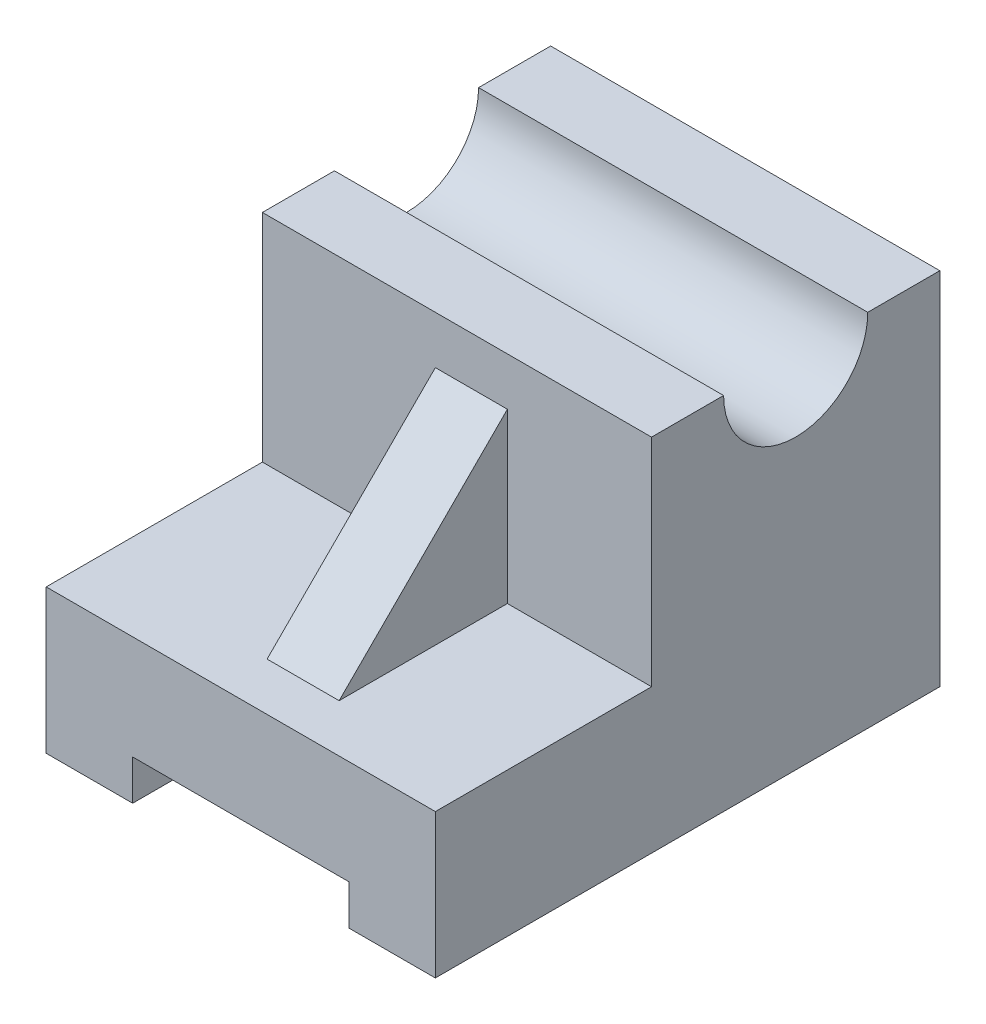
ISO-10303-21;
HEADER;
FILE_DESCRIPTION(('STEP AP214'),'2;1');
FILE_NAME('part.step','',(''),(''),'','','');
FILE_SCHEMA(('AUTOMOTIVE_DESIGN { 1 0 10303 214 1 1 1 1 }'));
ENDSEC;
DATA;
#1=APPLICATION_CONTEXT('core data for automotive mechanical design processes');
#2=APPLICATION_PROTOCOL_DEFINITION('international standard','automotive_design',2000,#1);
#3=PRODUCT_CONTEXT('',#1,'mechanical');
#4=PRODUCT('Part','Part','',(#3));
#5=PRODUCT_RELATED_PRODUCT_CATEGORY('part','',(#4));
#6=PRODUCT_DEFINITION_FORMATION('','',#4);
#7=PRODUCT_DEFINITION_CONTEXT('part definition',#1,'design');
#8=PRODUCT_DEFINITION('design','',#6,#7);
#9=PRODUCT_DEFINITION_SHAPE('','',#8);
#10=(LENGTH_UNIT() NAMED_UNIT(*) SI_UNIT(.MILLI.,.METRE.));
#11=(NAMED_UNIT(*) PLANE_ANGLE_UNIT() SI_UNIT($,.RADIAN.));
#12=(NAMED_UNIT(*) SI_UNIT($,.STERADIAN.) SOLID_ANGLE_UNIT());
#13=UNCERTAINTY_MEASURE_WITH_UNIT(LENGTH_MEASURE(1.E-05),#10,'distance_accuracy_value','');
#14=(GEOMETRIC_REPRESENTATION_CONTEXT(3) GLOBAL_UNCERTAINTY_ASSIGNED_CONTEXT((#13)) GLOBAL_UNIT_ASSIGNED_CONTEXT((#10,
#11,#12)) REPRESENTATION_CONTEXT('',''));
#15=CARTESIAN_POINT('',(0.,0.,0.));
#16=DIRECTION('',(0.,0.,1.));
#17=DIRECTION('',(1.,0.,0.));
#18=AXIS2_PLACEMENT_3D('',#15,#16,#17);
#19=CARTESIAN_POINT('',(54.,-2.07414286856958,27.9443072288378));
#20=DIRECTION('',(0.,1.,0.));
#21=DIRECTION('',(0.,0.,1.));
#22=AXIS2_PLACEMENT_3D('',#19,#20,#21);
#23=PLANE('',#22);
#24=DIRECTION('',(-1.,0.,0.));
#25=VECTOR('',#24,1.);
#26=CARTESIAN_POINT('',(54.,-2.07414286856958,-42.0556927711622));
#27=LINE('',#26,#25);
#28=CARTESIAN_POINT('',(12.,-2.07414286856958,-42.0556927711622));
#29=VERTEX_POINT('',#28);
#30=CARTESIAN_POINT('',(0.,-2.07414286856958,-42.0556927711622));
#31=VERTEX_POINT('',#30);
#32=EDGE_CURVE('E212',#29,#31,#27,.T.);
#33=ORIENTED_EDGE('',*,*,#32,.F.);
#34=DIRECTION('',(0.,0.,1.));
#35=VECTOR('',#34,1.);
#36=CARTESIAN_POINT('',(12.,-2.07414286856958,27.9443072288378));
#37=LINE('',#36,#35);
#38=CARTESIAN_POINT('',(12.,-2.07414286856958,27.9443072288378));
#39=VERTEX_POINT('',#38);
#40=EDGE_CURVE('E11',#29,#39,#37,.T.);
#41=ORIENTED_EDGE('',*,*,#40,.T.);
#42=DIRECTION('',(-1.,0.,0.));
#43=VECTOR('',#42,1.);
#44=CARTESIAN_POINT('',(54.,-2.07414286856958,27.9443072288378));
#45=LINE('',#44,#43);
#46=CARTESIAN_POINT('',(0.,-2.07414286856958,27.9443072288378));
#47=VERTEX_POINT('',#46);
#48=EDGE_CURVE('E230',#39,#47,#45,.T.);
#49=ORIENTED_EDGE('',*,*,#48,.T.);
#50=DIRECTION('',(0.,0.,-1.));
#51=VECTOR('',#50,1.);
#52=CARTESIAN_POINT('',(0.,-2.07414286856958,27.9443072288378));
#53=LINE('',#52,#51);
#54=EDGE_CURVE('E200',#47,#31,#53,.T.);
#55=ORIENTED_EDGE('',*,*,#54,.T.);
#56=EDGE_LOOP('',(#33,#41,#49,#55));
#57=FACE_BOUND('',#56,.T.);
#58=ADVANCED_FACE('F33',(#57),#23,.F.);
#59=CARTESIAN_POINT('',(54.,47.9258571314304,-42.0556927711622));
#60=DIRECTION('',(0.,-1.,0.));
#61=DIRECTION('',(0.,0.,-1.));
#62=AXIS2_PLACEMENT_3D('',#59,#60,#61);
#63=PLANE('',#62);
#64=DIRECTION('',(-1.,0.,0.));
#65=VECTOR('',#64,1.);
#66=CARTESIAN_POINT('',(54.,47.9258571314304,-42.0556927711622));
#67=LINE('',#66,#65);
#68=CARTESIAN_POINT('',(54.,47.9258571314304,-42.0556927711622));
#69=VERTEX_POINT('',#68);
#70=CARTESIAN_POINT('',(0.,47.9258571314304,-42.0556927711622));
#71=VERTEX_POINT('',#70);
#72=EDGE_CURVE('E244',#69,#71,#67,.T.);
#73=ORIENTED_EDGE('',*,*,#72,.T.);
#74=DIRECTION('',(0.,0.,1.));
#75=VECTOR('',#74,1.);
#76=CARTESIAN_POINT('',(0.,47.9258571314304,-42.0556927711622));
#77=LINE('',#76,#75);
#78=CARTESIAN_POINT('',(0.,47.9258571314304,-32.0556927711622));
#79=VERTEX_POINT('',#78);
#80=EDGE_CURVE('E216',#71,#79,#77,.T.);
#81=ORIENTED_EDGE('',*,*,#80,.T.);
#82=DIRECTION('',(1.,0.,0.));
#83=VECTOR('',#82,1.);
#84=CARTESIAN_POINT('',(0.,47.9258571314304,-32.0556927711622));
#85=LINE('',#84,#83);
#86=CARTESIAN_POINT('',(54.,47.9258571314304,-32.0556927711622));
#87=VERTEX_POINT('',#86);
#88=EDGE_CURVE('E193',#79,#87,#85,.T.);
#89=ORIENTED_EDGE('',*,*,#88,.T.);
#90=DIRECTION('',(0.,0.,1.));
#91=VECTOR('',#90,1.);
#92=CARTESIAN_POINT('',(54.,47.9258571314304,-42.0556927711622));
#93=LINE('',#92,#91);
#94=EDGE_CURVE('E201',#69,#87,#93,.T.);
#95=ORIENTED_EDGE('',*,*,#94,.F.);
#96=EDGE_LOOP('',(#73,#81,#89,#95));
#97=FACE_BOUND('',#96,.T.);
#98=ADVANCED_FACE('F271',(#97),#63,.F.);
#99=CARTESIAN_POINT('',(54.,-2.07414286856958,-42.0556927711622));
#100=DIRECTION('',(0.,0.,1.));
#101=DIRECTION('',(1.,0.,0.));
#102=AXIS2_PLACEMENT_3D('',#99,#100,#101);
#103=PLANE('',#102);
#104=DIRECTION('',(-1.,0.,0.));
#105=VECTOR('',#104,1.);
#106=CARTESIAN_POINT('',(42.,3.49160287105223,-42.0556927711622));
#107=LINE('',#106,#105);
#108=CARTESIAN_POINT('',(42.,3.49160287105223,-42.0556927711622));
#109=VERTEX_POINT('',#108);
#110=CARTESIAN_POINT('',(12.,3.49160287105223,-42.0556927711622));
#111=VERTEX_POINT('',#110);
#112=EDGE_CURVE('E147',#109,#111,#107,.T.);
#113=ORIENTED_EDGE('',*,*,#112,.T.);
#114=DIRECTION('',(0.,-1.,0.));
#115=VECTOR('',#114,1.);
#116=CARTESIAN_POINT('',(12.,-7.63988860819139,-42.0556927711622));
#117=LINE('',#116,#115);
#118=EDGE_CURVE('E159',#111,#29,#117,.T.);
#119=ORIENTED_EDGE('',*,*,#118,.T.);
#120=ORIENTED_EDGE('',*,*,#32,.T.);
#121=DIRECTION('',(0.,1.,0.));
#122=VECTOR('',#121,1.);
#123=CARTESIAN_POINT('',(0.,-2.07414286856958,-42.0556927711622));
#124=LINE('',#123,#122);
#125=EDGE_CURVE('E195',#31,#71,#124,.T.);
#126=ORIENTED_EDGE('',*,*,#125,.T.);
#127=ORIENTED_EDGE('',*,*,#72,.F.);
#128=DIRECTION('',(0.,1.,0.));
#129=VECTOR('',#128,1.);
#130=CARTESIAN_POINT('',(54.,-2.07414286856958,-42.0556927711622));
#131=LINE('',#130,#129);
#132=CARTESIAN_POINT('',(54.,-2.07414286856958,-42.0556927711622));
#133=VERTEX_POINT('',#132);
#134=EDGE_CURVE('E196',#133,#69,#131,.T.);
#135=ORIENTED_EDGE('',*,*,#134,.F.);
#136=CARTESIAN_POINT('',(42.,-2.07414286856958,-42.0556927711622));
#137=VERTEX_POINT('',#136);
#138=EDGE_CURVE('E158',#133,#137,#27,.T.);
#139=ORIENTED_EDGE('',*,*,#138,.T.);
#140=DIRECTION('',(0.,1.,0.));
#141=VECTOR('',#140,1.);
#142=CARTESIAN_POINT('',(42.,-7.63988860819139,-42.0556927711622));
#143=LINE('',#142,#141);
#144=EDGE_CURVE('E48',#137,#109,#143,.T.);
#145=ORIENTED_EDGE('',*,*,#144,.T.);
#146=EDGE_LOOP('',(#113,#119,#120,#126,#127,#135,#139,#145));
#147=FACE_BOUND('',#146,.T.);
#148=ADVANCED_FACE('F35',(#147),#103,.F.);
#149=DIRECTION('',(1.,0.,0.));
#150=VECTOR('',#149,1.);
#151=CARTESIAN_POINT('',(0.,47.9258571314304,-12.0556927711622));
#152=LINE('',#151,#150);
#153=CARTESIAN_POINT('',(54.,47.9258571314304,-12.0556927711622));
#154=VERTEX_POINT('',#153);
#155=CARTESIAN_POINT('',(0.,47.9258571314304,-12.0556927711622));
#156=VERTEX_POINT('',#155);
#157=EDGE_CURVE('E191',#154,#156,#152,.F.);
#158=ORIENTED_EDGE('',*,*,#157,.T.);
#159=CARTESIAN_POINT('',(0.,47.9258571314304,-2.05569277116222));
#160=VERTEX_POINT('',#159);
#161=EDGE_CURVE('E215',#156,#160,#77,.T.);
#162=ORIENTED_EDGE('',*,*,#161,.T.);
#163=DIRECTION('',(-1.,0.,0.));
#164=VECTOR('',#163,1.);
#165=CARTESIAN_POINT('',(54.,47.9258571314304,-2.05569277116222));
#166=LINE('',#165,#164);
#167=CARTESIAN_POINT('',(54.,47.9258571314304,-2.05569277116222));
#168=VERTEX_POINT('',#167);
#169=EDGE_CURVE('E241',#168,#160,#166,.T.);
#170=ORIENTED_EDGE('',*,*,#169,.F.);
#171=EDGE_CURVE('E199',#154,#168,#93,.T.);
#172=ORIENTED_EDGE('',*,*,#171,.F.);
#173=EDGE_LOOP('',(#158,#162,#170,#172));
#174=FACE_BOUND('',#173,.T.);
#175=ADVANCED_FACE('F288',(#174),#63,.F.);
#176=CARTESIAN_POINT('',(54.,47.9258571314304,-2.05569277116222));
#177=DIRECTION('',(0.,0.,-1.));
#178=DIRECTION('',(0.,1.,0.));
#179=AXIS2_PLACEMENT_3D('',#176,#177,#178);
#180=PLANE('',#179);
#181=DIRECTION('',(1.,0.,0.));
#182=VECTOR('',#181,1.);
#183=CARTESIAN_POINT('',(54.,41.2754960910573,-2.05569277116222));
#184=LINE('',#183,#182);
#185=CARTESIAN_POINT('',(24.,41.2754960910573,-2.05569277116222));
#186=VERTEX_POINT('',#185);
#187=CARTESIAN_POINT('',(34.,41.2754960910573,-2.05569277116222));
#188=VERTEX_POINT('',#187);
#189=EDGE_CURVE('E56',#186,#188,#184,.T.);
#190=ORIENTED_EDGE('',*,*,#189,.T.);
#191=DIRECTION('',(0.,-1.,0.));
#192=VECTOR('',#191,1.);
#193=CARTESIAN_POINT('',(34.,47.9258571314304,-2.05569277116222));
#194=LINE('',#193,#192);
#195=CARTESIAN_POINT('',(34.,17.9258571314304,-2.05569277116223));
#196=VERTEX_POINT('',#195);
#197=EDGE_CURVE('E183',#188,#196,#194,.T.);
#198=ORIENTED_EDGE('',*,*,#197,.T.);
#199=DIRECTION('',(-1.,0.,0.));
#200=VECTOR('',#199,1.);
#201=CARTESIAN_POINT('',(54.,17.9258571314304,-2.05569277116223));
#202=LINE('',#201,#200);
#203=CARTESIAN_POINT('',(54.,17.9258571314304,-2.05569277116223));
#204=VERTEX_POINT('',#203);
#205=EDGE_CURVE('E238',#204,#196,#202,.T.);
#206=ORIENTED_EDGE('',*,*,#205,.F.);
#207=DIRECTION('',(0.,-1.,0.));
#208=VECTOR('',#207,1.);
#209=CARTESIAN_POINT('',(54.,47.9258571314304,-2.05569277116222));
#210=LINE('',#209,#208);
#211=EDGE_CURVE('E204',#168,#204,#210,.T.);
#212=ORIENTED_EDGE('',*,*,#211,.F.);
#213=ORIENTED_EDGE('',*,*,#169,.T.);
#214=DIRECTION('',(0.,-1.,0.));
#215=VECTOR('',#214,1.);
#216=CARTESIAN_POINT('',(0.,47.9258571314304,-2.05569277116222));
#217=LINE('',#216,#215);
#218=CARTESIAN_POINT('',(0.,17.9258571314304,-2.05569277116223));
#219=VERTEX_POINT('',#218);
#220=EDGE_CURVE('E219',#160,#219,#217,.T.);
#221=ORIENTED_EDGE('',*,*,#220,.T.);
#222=CARTESIAN_POINT('',(24.,17.9258571314304,-2.05569277116223));
#223=VERTEX_POINT('',#222);
#224=EDGE_CURVE('E237',#223,#219,#202,.T.);
#225=ORIENTED_EDGE('',*,*,#224,.F.);
#226=DIRECTION('',(0.,-1.,0.));
#227=VECTOR('',#226,1.);
#228=CARTESIAN_POINT('',(24.,47.9258571314304,-2.05569277116222));
#229=LINE('',#228,#227);
#230=EDGE_CURVE('E178',#186,#223,#229,.T.);
#231=ORIENTED_EDGE('',*,*,#230,.F.);
#232=EDGE_LOOP('',(#190,#198,#206,#212,#213,#221,#225,#231));
#233=FACE_BOUND('',#232,.T.);
#234=ADVANCED_FACE('F282',(#233),#180,.F.);
#235=CARTESIAN_POINT('',(54.,17.9258571314304,-2.05569277116223));
#236=DIRECTION('',(0.,-1.,0.));
#237=DIRECTION('',(0.,0.,-1.));
#238=AXIS2_PLACEMENT_3D('',#235,#236,#237);
#239=PLANE('',#238);
#240=ORIENTED_EDGE('',*,*,#205,.T.);
#241=DIRECTION('',(0.,0.,1.));
#242=VECTOR('',#241,1.);
#243=CARTESIAN_POINT('',(34.,17.9258571314304,-2.05569277116223));
#244=LINE('',#243,#242);
#245=CARTESIAN_POINT('',(34.,17.9258571314304,21.2939461884643));
#246=VERTEX_POINT('',#245);
#247=EDGE_CURVE('E181',#196,#246,#244,.T.);
#248=ORIENTED_EDGE('',*,*,#247,.T.);
#249=DIRECTION('',(-1.,0.,0.));
#250=VECTOR('',#249,1.);
#251=CARTESIAN_POINT('',(54.,17.9258571314304,21.2939461884643));
#252=LINE('',#251,#250);
#253=CARTESIAN_POINT('',(24.,17.9258571314304,21.2939461884643));
#254=VERTEX_POINT('',#253);
#255=EDGE_CURVE('E185',#246,#254,#252,.T.);
#256=ORIENTED_EDGE('',*,*,#255,.T.);
#257=DIRECTION('',(0.,0.,1.));
#258=VECTOR('',#257,1.);
#259=CARTESIAN_POINT('',(24.,17.9258571314304,-2.05569277116223));
#260=LINE('',#259,#258);
#261=EDGE_CURVE('E173',#223,#254,#260,.T.);
#262=ORIENTED_EDGE('',*,*,#261,.F.);
#263=ORIENTED_EDGE('',*,*,#224,.T.);
#264=DIRECTION('',(0.,0.,1.));
#265=VECTOR('',#264,1.);
#266=CARTESIAN_POINT('',(0.,17.9258571314304,-2.05569277116223));
#267=LINE('',#266,#265);
#268=CARTESIAN_POINT('',(0.,17.9258571314304,27.9443072288378));
#269=VERTEX_POINT('',#268);
#270=EDGE_CURVE('E222',#219,#269,#267,.T.);
#271=ORIENTED_EDGE('',*,*,#270,.T.);
#272=DIRECTION('',(-1.,0.,0.));
#273=VECTOR('',#272,1.);
#274=CARTESIAN_POINT('',(54.,17.9258571314304,27.9443072288378));
#275=LINE('',#274,#273);
#276=CARTESIAN_POINT('',(54.,17.9258571314304,27.9443072288378));
#277=VERTEX_POINT('',#276);
#278=EDGE_CURVE('E234',#277,#269,#275,.T.);
#279=ORIENTED_EDGE('',*,*,#278,.F.);
#280=DIRECTION('',(0.,0.,1.));
#281=VECTOR('',#280,1.);
#282=CARTESIAN_POINT('',(54.,17.9258571314304,-2.05569277116223));
#283=LINE('',#282,#281);
#284=EDGE_CURVE('E206',#204,#277,#283,.T.);
#285=ORIENTED_EDGE('',*,*,#284,.F.);
#286=EDGE_LOOP('',(#240,#248,#256,#262,#263,#271,#279,#285));
#287=FACE_BOUND('',#286,.T.);
#288=ADVANCED_FACE('F280',(#287),#239,.F.);
#289=CARTESIAN_POINT('',(54.,17.9258571314304,27.9443072288378));
#290=DIRECTION('',(0.,0.,-1.));
#291=DIRECTION('',(0.,1.,0.));
#292=AXIS2_PLACEMENT_3D('',#289,#290,#291);
#293=PLANE('',#292);
#294=ORIENTED_EDGE('',*,*,#48,.F.);
#295=DIRECTION('',(0.,-1.,0.));
#296=VECTOR('',#295,1.);
#297=CARTESIAN_POINT('',(12.,-7.63988860819139,27.9443072288378));
#298=LINE('',#297,#296);
#299=CARTESIAN_POINT('',(12.,3.49160287105223,27.9443072288378));
#300=VERTEX_POINT('',#299);
#301=EDGE_CURVE('E164',#300,#39,#298,.T.);
#302=ORIENTED_EDGE('',*,*,#301,.F.);
#303=DIRECTION('',(-1.,0.,0.));
#304=VECTOR('',#303,1.);
#305=CARTESIAN_POINT('',(42.,3.49160287105223,27.9443072288378));
#306=LINE('',#305,#304);
#307=CARTESIAN_POINT('',(42.,3.49160287105223,27.9443072288378));
#308=VERTEX_POINT('',#307);
#309=EDGE_CURVE('E161',#308,#300,#306,.T.);
#310=ORIENTED_EDGE('',*,*,#309,.F.);
#311=DIRECTION('',(0.,1.,0.));
#312=VECTOR('',#311,1.);
#313=CARTESIAN_POINT('',(42.,-7.63988860819139,27.9443072288378));
#314=LINE('',#313,#312);
#315=CARTESIAN_POINT('',(42.,-2.07414286856958,27.9443072288378));
#316=VERTEX_POINT('',#315);
#317=EDGE_CURVE('E142',#316,#308,#314,.T.);
#318=ORIENTED_EDGE('',*,*,#317,.F.);
#319=CARTESIAN_POINT('',(54.,-2.07414286856958,27.9443072288378));
#320=VERTEX_POINT('',#319);
#321=EDGE_CURVE('E231',#320,#316,#45,.T.);
#322=ORIENTED_EDGE('',*,*,#321,.F.);
#323=DIRECTION('',(0.,-1.,0.));
#324=VECTOR('',#323,1.);
#325=CARTESIAN_POINT('',(54.,17.9258571314304,27.9443072288378));
#326=LINE('',#325,#324);
#327=EDGE_CURVE('E208',#277,#320,#326,.T.);
#328=ORIENTED_EDGE('',*,*,#327,.F.);
#329=ORIENTED_EDGE('',*,*,#278,.T.);
#330=DIRECTION('',(0.,-1.,0.));
#331=VECTOR('',#330,1.);
#332=CARTESIAN_POINT('',(0.,17.9258571314304,27.9443072288378));
#333=LINE('',#332,#331);
#334=EDGE_CURVE('E224',#269,#47,#333,.T.);
#335=ORIENTED_EDGE('',*,*,#334,.T.);
#336=EDGE_LOOP('',(#294,#302,#310,#318,#322,#328,#329,#335));
#337=FACE_BOUND('',#336,.T.);
#338=ADVANCED_FACE('F254',(#337),#293,.F.);
#339=ORIENTED_EDGE('',*,*,#321,.T.);
#340=DIRECTION('',(0.,0.,-1.));
#341=VECTOR('',#340,1.);
#342=CARTESIAN_POINT('',(42.,-2.07414286856958,27.9443072288378));
#343=LINE('',#342,#341);
#344=EDGE_CURVE('E41',#316,#137,#343,.T.);
#345=ORIENTED_EDGE('',*,*,#344,.T.);
#346=ORIENTED_EDGE('',*,*,#138,.F.);
#347=DIRECTION('',(0.,0.,-1.));
#348=VECTOR('',#347,1.);
#349=CARTESIAN_POINT('',(54.,-2.07414286856958,27.9443072288378));
#350=LINE('',#349,#348);
#351=EDGE_CURVE('E210',#320,#133,#350,.T.);
#352=ORIENTED_EDGE('',*,*,#351,.F.);
#353=EDGE_LOOP('',(#339,#345,#346,#352));
#354=FACE_BOUND('',#353,.T.);
#355=ADVANCED_FACE('F249',(#354),#23,.F.);
#356=CARTESIAN_POINT('',(54.,0.,0.));
#357=DIRECTION('',(1.,0.,0.));
#358=DIRECTION('',(0.,0.,-1.));
#359=AXIS2_PLACEMENT_3D('',#356,#357,#358);
#360=PLANE('',#359);
#361=CARTESIAN_POINT('',(54.,47.9258571314304,-22.0556927711622));
#362=DIRECTION('',(1.,0.,0.));
#363=DIRECTION('',(0.,0.,-1.));
#364=AXIS2_PLACEMENT_3D('',#361,#362,#363);
#365=CIRCLE('',#364,10.);
#366=EDGE_CURVE('E188',#154,#87,#365,.T.);
#367=ORIENTED_EDGE('',*,*,#366,.F.);
#368=ORIENTED_EDGE('',*,*,#171,.T.);
#369=ORIENTED_EDGE('',*,*,#211,.T.);
#370=ORIENTED_EDGE('',*,*,#284,.T.);
#371=ORIENTED_EDGE('',*,*,#327,.T.);
#372=ORIENTED_EDGE('',*,*,#351,.T.);
#373=ORIENTED_EDGE('',*,*,#134,.T.);
#374=ORIENTED_EDGE('',*,*,#94,.T.);
#375=EDGE_LOOP('',(#367,#368,#369,#370,#371,#372,#373,#374));
#376=FACE_BOUND('',#375,.T.);
#377=ADVANCED_FACE('F274',(#376),#360,.T.);
#378=CARTESIAN_POINT('',(0.,0.,0.));
#379=DIRECTION('',(1.,0.,0.));
#380=DIRECTION('',(0.,0.,-1.));
#381=AXIS2_PLACEMENT_3D('',#378,#379,#380);
#382=PLANE('',#381);
#383=ORIENTED_EDGE('',*,*,#161,.F.);
#384=CARTESIAN_POINT('',(0.,47.9258571314304,-22.0556927711622));
#385=DIRECTION('',(1.,0.,0.));
#386=DIRECTION('',(0.,0.,-1.));
#387=AXIS2_PLACEMENT_3D('',#384,#385,#386);
#388=CIRCLE('',#387,10.);
#389=EDGE_CURVE('E246',#156,#79,#388,.T.);
#390=ORIENTED_EDGE('',*,*,#389,.T.);
#391=ORIENTED_EDGE('',*,*,#80,.F.);
#392=ORIENTED_EDGE('',*,*,#125,.F.);
#393=ORIENTED_EDGE('',*,*,#54,.F.);
#394=ORIENTED_EDGE('',*,*,#334,.F.);
#395=ORIENTED_EDGE('',*,*,#270,.F.);
#396=ORIENTED_EDGE('',*,*,#220,.F.);
#397=EDGE_LOOP('',(#383,#390,#391,#392,#393,#394,#395,#396));
#398=FACE_BOUND('',#397,.T.);
#399=ADVANCED_FACE('F267',(#398),#382,.F.);
#400=CARTESIAN_POINT('',(0.,47.9258571314304,-22.0556927711622));
#401=DIRECTION('',(1.,0.,0.));
#402=DIRECTION('',(0.,0.,-1.));
#403=AXIS2_PLACEMENT_3D('',#400,#401,#402);
#404=CYLINDRICAL_SURFACE('',#403,10.);
#405=ORIENTED_EDGE('',*,*,#366,.T.);
#406=ORIENTED_EDGE('',*,*,#88,.F.);
#407=ORIENTED_EDGE('',*,*,#389,.F.);
#408=ORIENTED_EDGE('',*,*,#157,.F.);
#409=EDGE_LOOP('',(#405,#406,#407,#408));
#410=FACE_BOUND('',#409,.T.);
#411=ADVANCED_FACE('F290',(#410),#404,.F.);
#412=CARTESIAN_POINT('',(34.,43.7743950858902,-4.55459176599504));
#413=DIRECTION('',(0.,0.707106781186541,0.707106781186554));
#414=DIRECTION('',(0.,-0.707106781186554,0.707106781186541));
#415=AXIS2_PLACEMENT_3D('',#412,#413,#414);
#416=PLANE('',#415);
#417=ORIENTED_EDGE('',*,*,#189,.F.);
#418=DIRECTION('',(0.,-0.707106781186554,0.707106781186541));
#419=VECTOR('',#418,1.);
#420=CARTESIAN_POINT('',(24.,43.7743950858902,-4.55459176599504));
#421=LINE('',#420,#419);
#422=EDGE_CURVE('E168',#186,#254,#421,.T.);
#423=ORIENTED_EDGE('',*,*,#422,.T.);
#424=ORIENTED_EDGE('',*,*,#255,.F.);
#425=DIRECTION('',(0.,-0.707106781186554,0.707106781186541));
#426=VECTOR('',#425,1.);
#427=CARTESIAN_POINT('',(34.,43.7743950858902,-4.55459176599504));
#428=LINE('',#427,#426);
#429=EDGE_CURVE('E170',#188,#246,#428,.T.);
#430=ORIENTED_EDGE('',*,*,#429,.F.);
#431=EDGE_LOOP('',(#417,#423,#424,#430));
#432=FACE_BOUND('',#431,.T.);
#433=ADVANCED_FACE('F297',(#432),#416,.T.);
#434=CARTESIAN_POINT('',(34.,22.9258571314304,-7.05569277116222));
#435=DIRECTION('',(1.,0.,0.));
#436=DIRECTION('',(0.,0.,-1.));
#437=AXIS2_PLACEMENT_3D('',#434,#435,#436);
#438=PLANE('',#437);
#439=ORIENTED_EDGE('',*,*,#197,.F.);
#440=ORIENTED_EDGE('',*,*,#429,.T.);
#441=ORIENTED_EDGE('',*,*,#247,.F.);
#442=EDGE_LOOP('',(#439,#440,#441));
#443=FACE_BOUND('',#442,.T.);
#444=ADVANCED_FACE('F294',(#443),#438,.T.);
#445=CARTESIAN_POINT('',(24.,22.9258571314304,-7.05569277116222));
#446=DIRECTION('',(1.,0.,0.));
#447=DIRECTION('',(0.,0.,-1.));
#448=AXIS2_PLACEMENT_3D('',#445,#446,#447);
#449=PLANE('',#448);
#450=ORIENTED_EDGE('',*,*,#422,.F.);
#451=ORIENTED_EDGE('',*,*,#230,.T.);
#452=ORIENTED_EDGE('',*,*,#261,.T.);
#453=EDGE_LOOP('',(#450,#451,#452));
#454=FACE_BOUND('',#453,.T.);
#455=ADVANCED_FACE('F300',(#454),#449,.F.);
#456=CARTESIAN_POINT('',(12.,-7.63988860819139,-42.0556927711622));
#457=DIRECTION('',(-1.,0.,0.));
#458=DIRECTION('',(0.,0.,1.));
#459=AXIS2_PLACEMENT_3D('',#456,#457,#458);
#460=PLANE('',#459);
#461=ORIENTED_EDGE('',*,*,#118,.F.);
#462=DIRECTION('',(0.,0.,1.));
#463=VECTOR('',#462,1.);
#464=CARTESIAN_POINT('',(12.,3.49160287105223,-42.0556927711622));
#465=LINE('',#464,#463);
#466=EDGE_CURVE('E146',#111,#300,#465,.T.);
#467=ORIENTED_EDGE('',*,*,#466,.T.);
#468=ORIENTED_EDGE('',*,*,#301,.T.);
#469=ORIENTED_EDGE('',*,*,#40,.F.);
#470=EDGE_LOOP('',(#461,#467,#468,#469));
#471=FACE_BOUND('',#470,.T.);
#472=ADVANCED_FACE('F258',(#471),#460,.F.);
#473=CARTESIAN_POINT('',(42.,-7.63988860819139,-42.0556927711622));
#474=DIRECTION('',(1.,0.,0.));
#475=DIRECTION('',(0.,0.,-1.));
#476=AXIS2_PLACEMENT_3D('',#473,#474,#475);
#477=PLANE('',#476);
#478=ORIENTED_EDGE('',*,*,#317,.T.);
#479=DIRECTION('',(0.,0.,1.));
#480=VECTOR('',#479,1.);
#481=CARTESIAN_POINT('',(42.,3.49160287105223,-42.0556927711622));
#482=LINE('',#481,#480);
#483=EDGE_CURVE('E138',#109,#308,#482,.T.);
#484=ORIENTED_EDGE('',*,*,#483,.F.);
#485=ORIENTED_EDGE('',*,*,#144,.F.);
#486=ORIENTED_EDGE('',*,*,#344,.F.);
#487=EDGE_LOOP('',(#478,#484,#485,#486));
#488=FACE_BOUND('',#487,.T.);
#489=ADVANCED_FACE('F140',(#488),#477,.F.);
#490=CARTESIAN_POINT('',(42.,3.49160287105223,-42.0556927711622));
#491=DIRECTION('',(0.,1.,0.));
#492=DIRECTION('',(0.,0.,1.));
#493=AXIS2_PLACEMENT_3D('',#490,#491,#492);
#494=PLANE('',#493);
#495=ORIENTED_EDGE('',*,*,#309,.T.);
#496=ORIENTED_EDGE('',*,*,#466,.F.);
#497=ORIENTED_EDGE('',*,*,#112,.F.);
#498=ORIENTED_EDGE('',*,*,#483,.T.);
#499=EDGE_LOOP('',(#495,#496,#497,#498));
#500=FACE_BOUND('',#499,.T.);
#501=ADVANCED_FACE('F150',(#500),#494,.F.);
#502=CLOSED_SHELL('',(#58,#98,#148,#175,#234,#288,#338,#355,#377,#399,#411,#433,#444,#455,#472,
#489,#501));
#503=MANIFOLD_SOLID_BREP('B2',#502);
#504=ADVANCED_BREP_SHAPE_REPRESENTATION('',(#18,#503),#14);
#505=SHAPE_DEFINITION_REPRESENTATION(#9,#504);
ENDSEC;
END-ISO-10303-21;
